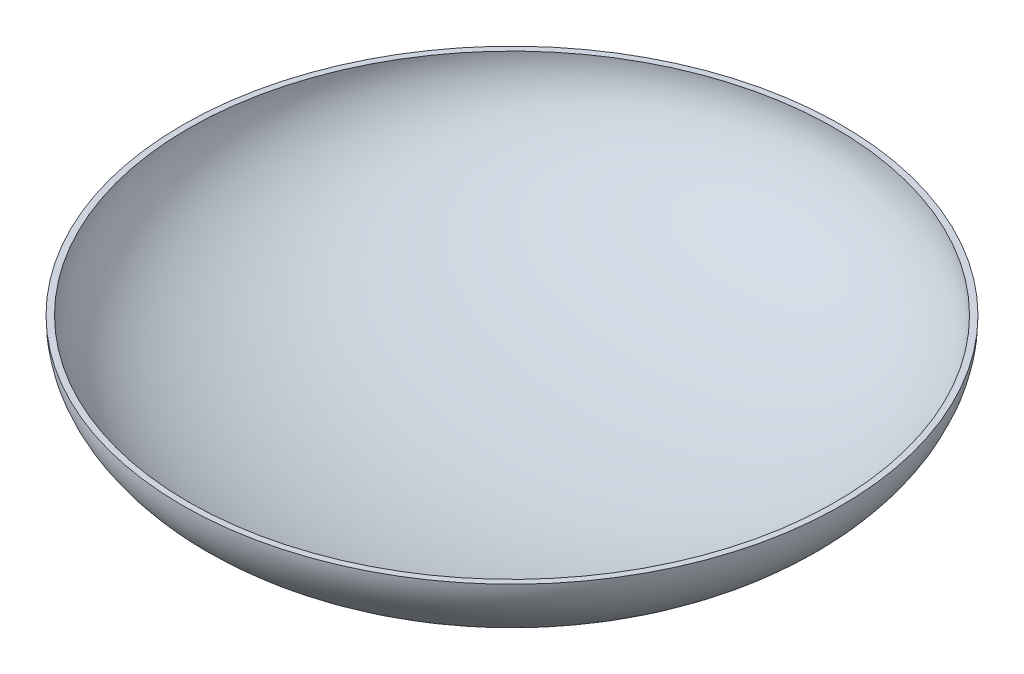
ISO-10303-21;
HEADER;
FILE_DESCRIPTION(('STEP AP214'),'2;1');
FILE_NAME('part.step','',(''),(''),'','','');
FILE_SCHEMA(('AUTOMOTIVE_DESIGN { 1 0 10303 214 1 1 1 1 }'));
ENDSEC;
DATA;
#1=APPLICATION_CONTEXT('core data for automotive mechanical design processes');
#2=APPLICATION_PROTOCOL_DEFINITION('international standard','automotive_design',2000,#1);
#3=PRODUCT_CONTEXT('',#1,'mechanical');
#4=PRODUCT('Part','Part','',(#3));
#5=PRODUCT_RELATED_PRODUCT_CATEGORY('part','',(#4));
#6=PRODUCT_DEFINITION_FORMATION('','',#4);
#7=PRODUCT_DEFINITION_CONTEXT('part definition',#1,'design');
#8=PRODUCT_DEFINITION('design','',#6,#7);
#9=PRODUCT_DEFINITION_SHAPE('','',#8);
#10=(LENGTH_UNIT() NAMED_UNIT(*) SI_UNIT(.MILLI.,.METRE.));
#11=(NAMED_UNIT(*) PLANE_ANGLE_UNIT() SI_UNIT($,.RADIAN.));
#12=(NAMED_UNIT(*) SI_UNIT($,.STERADIAN.) SOLID_ANGLE_UNIT());
#13=UNCERTAINTY_MEASURE_WITH_UNIT(LENGTH_MEASURE(1.E-05),#10,'distance_accuracy_value','');
#14=(GEOMETRIC_REPRESENTATION_CONTEXT(3) GLOBAL_UNCERTAINTY_ASSIGNED_CONTEXT((#13)) GLOBAL_UNIT_ASSIGNED_CONTEXT((#10,
#11,#12)) REPRESENTATION_CONTEXT('',''));
#15=CARTESIAN_POINT('',(0.,0.,0.));
#16=DIRECTION('',(0.,0.,1.));
#17=DIRECTION('',(1.,0.,0.));
#18=AXIS2_PLACEMENT_3D('',#15,#16,#17);
#19=CARTESIAN_POINT('',(0.,-61.8724275978353,0.));
#20=DIRECTION('',(0.,0.,-1.));
#21=DIRECTION('',(1.,0.,0.));
#22=AXIS2_PLACEMENT_3D('',#19,#20,#21);
#23=ELLIPSE('',#22,137.16,55.88);
#24=TRIMMED_CURVE('',#23,(PARAMETER_VALUE(1.5707963267949)),(PARAMETER_VALUE(4.71238898038469)),
.T.,.PARAMETER.);
#25=CARTESIAN_POINT('',(0.,-117.752427597835,0.));
#26=DIRECTION('',(0.,1.,0.));
#27=AXIS1_PLACEMENT('',#25,#26);
#28=SURFACE_OF_REVOLUTION('',#24,#27);
#29=CARTESIAN_POINT('',(0.,-61.8724275978353,0.));
#30=DIRECTION('',(0.,1.,0.));
#31=DIRECTION('',(0.,0.,1.));
#32=AXIS2_PLACEMENT_3D('',#29,#30,#31);
#33=CIRCLE('',#32,137.16);
#34=CARTESIAN_POINT('',(0.,-61.8724275978353,137.16));
#35=VERTEX_POINT('',#34);
#36=EDGE_CURVE('E11',#35,#35,#33,.T.);
#37=ORIENTED_EDGE('',*,*,#36,.T.);
#38=EDGE_LOOP('',(#37));
#39=FACE_BOUND('',#38,.T.);
#40=CARTESIAN_POINT('',(0.,-117.752427597835,0.));
#41=VERTEX_POINT('',#40);
#42=VERTEX_LOOP('',#41);
#43=FACE_BOUND('',#42,.T.);
#44=ADVANCED_FACE('F33',(#39,#43),#28,.F.);
#45=CARTESIAN_POINT('',(-137.16,-61.8724275978353,0.));
#46=DIRECTION('',(0.,1.,0.));
#47=DIRECTION('',(0.,0.,1.));
#48=AXIS2_PLACEMENT_3D('',#45,#46,#47);
#49=PLANE('',#48);
#50=CARTESIAN_POINT('',(0.,-61.8724275978353,0.));
#51=DIRECTION('',(0.,1.,0.));
#52=DIRECTION('',(0.,0.,1.));
#53=AXIS2_PLACEMENT_3D('',#50,#51,#52);
#54=CIRCLE('',#53,139.7);
#55=CARTESIAN_POINT('',(0.,-61.8724275978353,139.7));
#56=VERTEX_POINT('',#55);
#57=EDGE_CURVE('E41',#56,#56,#54,.T.);
#58=ORIENTED_EDGE('',*,*,#57,.T.);
#59=EDGE_LOOP('',(#58));
#60=FACE_BOUND('',#59,.T.);
#61=ORIENTED_EDGE('',*,*,#36,.F.);
#62=EDGE_LOOP('',(#61));
#63=FACE_BOUND('',#62,.T.);
#64=ADVANCED_FACE('F50',(#60,#63),#49,.T.);
#65=CARTESIAN_POINT('',(0.,-61.8724275978353,0.));
#66=DIRECTION('',(0.,0.,1.));
#67=DIRECTION('',(1.,0.,0.));
#68=AXIS2_PLACEMENT_3D('',#65,#66,#67);
#69=ELLIPSE('',#68,139.7,58.42);
#70=TRIMMED_CURVE('',#69,(PARAMETER_VALUE(1.5707963267949)),(PARAMETER_VALUE(4.71238898038469)),
.T.,.PARAMETER.);
#71=CARTESIAN_POINT('',(0.,-117.752427597835,0.));
#72=DIRECTION('',(0.,1.,0.));
#73=AXIS1_PLACEMENT('',#71,#72);
#74=SURFACE_OF_REVOLUTION('',#70,#73);
#75=CARTESIAN_POINT('',(0.,-120.292427597835,0.));
#76=VERTEX_POINT('',#75);
#77=VERTEX_LOOP('',#76);
#78=FACE_BOUND('',#77,.T.);
#79=ORIENTED_EDGE('',*,*,#57,.F.);
#80=EDGE_LOOP('',(#79));
#81=FACE_BOUND('',#80,.T.);
#82=ADVANCED_FACE('F47',(#78,#81),#74,.F.);
#83=CLOSED_SHELL('',(#44,#64,#82));
#84=MANIFOLD_SOLID_BREP('B2',#83);
#85=ADVANCED_BREP_SHAPE_REPRESENTATION('',(#18,#84),#14);
#86=SHAPE_DEFINITION_REPRESENTATION(#9,#85);
ENDSEC;
END-ISO-10303-21;
